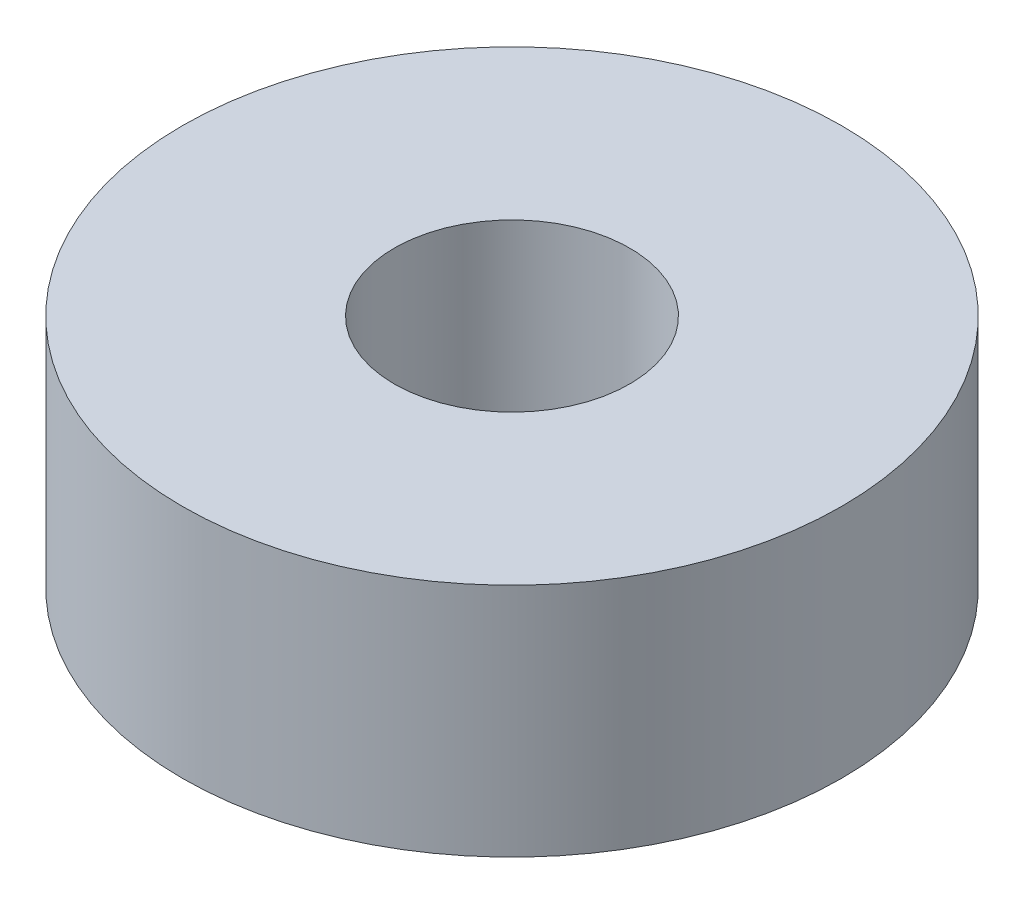
ISO-10303-21;
HEADER;
FILE_DESCRIPTION(('STEP AP214'),'2;1');
FILE_NAME('part.step','',(''),(''),'','','');
FILE_SCHEMA(('AUTOMOTIVE_DESIGN { 1 0 10303 214 1 1 1 1 }'));
ENDSEC;
DATA;
#1=APPLICATION_CONTEXT('core data for automotive mechanical design processes');
#2=APPLICATION_PROTOCOL_DEFINITION('international standard','automotive_design',2000,#1);
#3=PRODUCT_CONTEXT('',#1,'mechanical');
#4=PRODUCT('Part','Part','',(#3));
#5=PRODUCT_RELATED_PRODUCT_CATEGORY('part','',(#4));
#6=PRODUCT_DEFINITION_FORMATION('','',#4);
#7=PRODUCT_DEFINITION_CONTEXT('part definition',#1,'design');
#8=PRODUCT_DEFINITION('design','',#6,#7);
#9=PRODUCT_DEFINITION_SHAPE('','',#8);
#10=(LENGTH_UNIT() NAMED_UNIT(*) SI_UNIT(.MILLI.,.METRE.));
#11=(NAMED_UNIT(*) PLANE_ANGLE_UNIT() SI_UNIT($,.RADIAN.));
#12=(NAMED_UNIT(*) SI_UNIT($,.STERADIAN.) SOLID_ANGLE_UNIT());
#13=UNCERTAINTY_MEASURE_WITH_UNIT(LENGTH_MEASURE(1.E-05),#10,'distance_accuracy_value','');
#14=(GEOMETRIC_REPRESENTATION_CONTEXT(3) GLOBAL_UNCERTAINTY_ASSIGNED_CONTEXT((#13)) GLOBAL_UNIT_ASSIGNED_CONTEXT((#10,
#11,#12)) REPRESENTATION_CONTEXT('',''));
#15=CARTESIAN_POINT('',(0.,0.,0.));
#16=DIRECTION('',(0.,0.,1.));
#17=DIRECTION('',(1.,0.,0.));
#18=AXIS2_PLACEMENT_3D('',#15,#16,#17);
#19=CARTESIAN_POINT('',(0.,5.,0.));
#20=DIRECTION('',(0.,1.,0.));
#21=DIRECTION('',(0.,0.,1.));
#22=AXIS2_PLACEMENT_3D('',#19,#20,#21);
#23=PLANE('',#22);
#24=CARTESIAN_POINT('',(0.,5.,0.));
#25=DIRECTION('',(0.,1.,0.));
#26=DIRECTION('',(0.,0.,1.));
#27=AXIS2_PLACEMENT_3D('',#24,#25,#26);
#28=CIRCLE('',#27,7.);
#29=CARTESIAN_POINT('',(0.,5.,7.));
#30=VERTEX_POINT('',#29);
#31=EDGE_CURVE('E10',#30,#30,#28,.T.);
#32=ORIENTED_EDGE('',*,*,#31,.T.);
#33=EDGE_LOOP('',(#32));
#34=FACE_BOUND('',#33,.T.);
#35=CARTESIAN_POINT('',(0.,5.,0.));
#36=DIRECTION('',(0.,1.,0.));
#37=DIRECTION('',(0.,0.,1.));
#38=AXIS2_PLACEMENT_3D('',#35,#36,#37);
#39=CIRCLE('',#38,2.5);
#40=CARTESIAN_POINT('',(0.,5.,2.5));
#41=VERTEX_POINT('',#40);
#42=EDGE_CURVE('E44',#41,#41,#39,.T.);
#43=ORIENTED_EDGE('',*,*,#42,.F.);
#44=EDGE_LOOP('',(#43));
#45=FACE_BOUND('',#44,.T.);
#46=ADVANCED_FACE('F33',(#34,#45),#23,.T.);
#47=CARTESIAN_POINT('',(0.,0.,0.));
#48=DIRECTION('',(0.,1.,0.));
#49=DIRECTION('',(0.,0.,1.));
#50=AXIS2_PLACEMENT_3D('',#47,#48,#49);
#51=PLANE('',#50);
#52=CARTESIAN_POINT('',(0.,0.,0.));
#53=DIRECTION('',(0.,1.,0.));
#54=DIRECTION('',(0.,0.,1.));
#55=AXIS2_PLACEMENT_3D('',#52,#53,#54);
#56=CIRCLE('',#55,7.);
#57=CARTESIAN_POINT('',(0.,0.,7.));
#58=VERTEX_POINT('',#57);
#59=EDGE_CURVE('E37',#58,#58,#56,.T.);
#60=ORIENTED_EDGE('',*,*,#59,.F.);
#61=EDGE_LOOP('',(#60));
#62=FACE_BOUND('',#61,.T.);
#63=CARTESIAN_POINT('',(0.,0.,0.));
#64=DIRECTION('',(0.,1.,0.));
#65=DIRECTION('',(0.,0.,1.));
#66=AXIS2_PLACEMENT_3D('',#63,#64,#65);
#67=CIRCLE('',#66,2.5);
#68=CARTESIAN_POINT('',(0.,0.,2.5));
#69=VERTEX_POINT('',#68);
#70=EDGE_CURVE('E46',#69,#69,#67,.T.);
#71=ORIENTED_EDGE('',*,*,#70,.T.);
#72=EDGE_LOOP('',(#71));
#73=FACE_BOUND('',#72,.T.);
#74=ADVANCED_FACE('F56',(#62,#73),#51,.F.);
#75=CARTESIAN_POINT('',(0.,5.,0.));
#76=DIRECTION('',(0.,-1.,0.));
#77=DIRECTION('',(0.,0.,-1.));
#78=AXIS2_PLACEMENT_3D('',#75,#76,#77);
#79=CYLINDRICAL_SURFACE('',#78,7.);
#80=ORIENTED_EDGE('',*,*,#31,.F.);
#81=EDGE_LOOP('',(#80));
#82=FACE_BOUND('',#81,.T.);
#83=ORIENTED_EDGE('',*,*,#59,.T.);
#84=EDGE_LOOP('',(#83));
#85=FACE_BOUND('',#84,.T.);
#86=ADVANCED_FACE('F35',(#82,#85),#79,.T.);
#87=CARTESIAN_POINT('',(0.,5.,0.));
#88=DIRECTION('',(0.,-1.,0.));
#89=DIRECTION('',(0.,0.,-1.));
#90=AXIS2_PLACEMENT_3D('',#87,#88,#89);
#91=CYLINDRICAL_SURFACE('',#90,2.5);
#92=ORIENTED_EDGE('',*,*,#42,.T.);
#93=EDGE_LOOP('',(#92));
#94=FACE_BOUND('',#93,.T.);
#95=ORIENTED_EDGE('',*,*,#70,.F.);
#96=EDGE_LOOP('',(#95));
#97=FACE_BOUND('',#96,.T.);
#98=ADVANCED_FACE('F52',(#94,#97),#91,.F.);
#99=CLOSED_SHELL('',(#46,#74,#86,#98));
#100=MANIFOLD_SOLID_BREP('B2',#99);
#101=ADVANCED_BREP_SHAPE_REPRESENTATION('',(#18,#100),#14);
#102=SHAPE_DEFINITION_REPRESENTATION(#9,#101);
ENDSEC;
END-ISO-10303-21;
